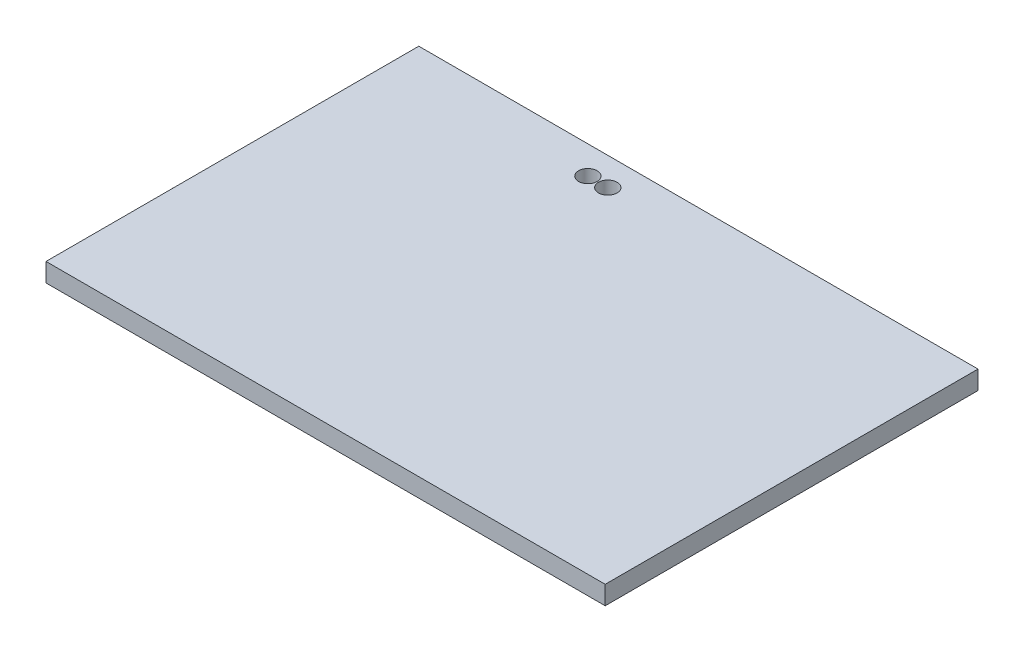
ISO-10303-21;
HEADER;
FILE_DESCRIPTION(('STEP AP214'),'2;1');
FILE_NAME('part.step','',(''),(''),'','','');
FILE_SCHEMA(('AUTOMOTIVE_DESIGN { 1 0 10303 214 1 1 1 1 }'));
ENDSEC;
DATA;
#1=APPLICATION_CONTEXT('core data for automotive mechanical design processes');
#2=APPLICATION_PROTOCOL_DEFINITION('international standard','automotive_design',2000,#1);
#3=PRODUCT_CONTEXT('',#1,'mechanical');
#4=PRODUCT('Part','Part','',(#3));
#5=PRODUCT_RELATED_PRODUCT_CATEGORY('part','',(#4));
#6=PRODUCT_DEFINITION_FORMATION('','',#4);
#7=PRODUCT_DEFINITION_CONTEXT('part definition',#1,'design');
#8=PRODUCT_DEFINITION('design','',#6,#7);
#9=PRODUCT_DEFINITION_SHAPE('','',#8);
#10=(LENGTH_UNIT() NAMED_UNIT(*) SI_UNIT(.MILLI.,.METRE.));
#11=(NAMED_UNIT(*) PLANE_ANGLE_UNIT() SI_UNIT($,.RADIAN.));
#12=(NAMED_UNIT(*) SI_UNIT($,.STERADIAN.) SOLID_ANGLE_UNIT());
#13=UNCERTAINTY_MEASURE_WITH_UNIT(LENGTH_MEASURE(1.E-05),#10,'distance_accuracy_value','');
#14=(GEOMETRIC_REPRESENTATION_CONTEXT(3) GLOBAL_UNCERTAINTY_ASSIGNED_CONTEXT((#13)) GLOBAL_UNIT_ASSIGNED_CONTEXT((#10,
#11,#12)) REPRESENTATION_CONTEXT('',''));
#15=CARTESIAN_POINT('',(0.,0.,0.));
#16=DIRECTION('',(0.,0.,1.));
#17=DIRECTION('',(1.,0.,0.));
#18=AXIS2_PLACEMENT_3D('',#15,#16,#17);
#19=CARTESIAN_POINT('',(150.,10.,100.));
#20=DIRECTION('',(-1.,0.,0.));
#21=DIRECTION('',(0.,0.,1.));
#22=AXIS2_PLACEMENT_3D('',#19,#20,#21);
#23=PLANE('',#22);
#24=DIRECTION('',(0.,0.,-1.));
#25=VECTOR('',#24,1.);
#26=CARTESIAN_POINT('',(150.,0.,100.));
#27=LINE('',#26,#25);
#28=CARTESIAN_POINT('',(150.,0.,100.));
#29=VERTEX_POINT('',#28);
#30=CARTESIAN_POINT('',(150.,0.,-100.));
#31=VERTEX_POINT('',#30);
#32=EDGE_CURVE('E96',#29,#31,#27,.T.);
#33=ORIENTED_EDGE('',*,*,#32,.T.);
#34=DIRECTION('',(0.,-1.,0.));
#35=VECTOR('',#34,1.);
#36=CARTESIAN_POINT('',(150.,10.,-100.));
#37=LINE('',#36,#35);
#38=CARTESIAN_POINT('',(150.,10.,-100.));
#39=VERTEX_POINT('',#38);
#40=EDGE_CURVE('E11',#39,#31,#37,.T.);
#41=ORIENTED_EDGE('',*,*,#40,.F.);
#42=DIRECTION('',(0.,0.,-1.));
#43=VECTOR('',#42,1.);
#44=CARTESIAN_POINT('',(150.,10.,100.));
#45=LINE('',#44,#43);
#46=CARTESIAN_POINT('',(150.,10.,100.));
#47=VERTEX_POINT('',#46);
#48=EDGE_CURVE('E84',#47,#39,#45,.T.);
#49=ORIENTED_EDGE('',*,*,#48,.F.);
#50=DIRECTION('',(0.,-1.,0.));
#51=VECTOR('',#50,1.);
#52=CARTESIAN_POINT('',(150.,10.,100.));
#53=LINE('',#52,#51);
#54=EDGE_CURVE('E92',#47,#29,#53,.T.);
#55=ORIENTED_EDGE('',*,*,#54,.T.);
#56=EDGE_LOOP('',(#33,#41,#49,#55));
#57=FACE_BOUND('',#56,.T.);
#58=ADVANCED_FACE('F33',(#57),#23,.F.);
#59=CARTESIAN_POINT('',(-150.,10.,-100.));
#60=DIRECTION('',(0.,0.,1.));
#61=DIRECTION('',(1.,0.,0.));
#62=AXIS2_PLACEMENT_3D('',#59,#60,#61);
#63=PLANE('',#62);
#64=DIRECTION('',(-1.,0.,0.));
#65=VECTOR('',#64,1.);
#66=CARTESIAN_POINT('',(-150.,0.,-100.));
#67=LINE('',#66,#65);
#68=CARTESIAN_POINT('',(-150.,0.,-100.));
#69=VERTEX_POINT('',#68);
#70=EDGE_CURVE('E88',#31,#69,#67,.T.);
#71=ORIENTED_EDGE('',*,*,#70,.T.);
#72=DIRECTION('',(0.,-1.,0.));
#73=VECTOR('',#72,1.);
#74=CARTESIAN_POINT('',(-150.,10.,-100.));
#75=LINE('',#74,#73);
#76=CARTESIAN_POINT('',(-150.,10.,-100.));
#77=VERTEX_POINT('',#76);
#78=EDGE_CURVE('E41',#77,#69,#75,.T.);
#79=ORIENTED_EDGE('',*,*,#78,.F.);
#80=DIRECTION('',(-1.,0.,0.));
#81=VECTOR('',#80,1.);
#82=CARTESIAN_POINT('',(-150.,10.,-100.));
#83=LINE('',#82,#81);
#84=EDGE_CURVE('E79',#39,#77,#83,.T.);
#85=ORIENTED_EDGE('',*,*,#84,.F.);
#86=ORIENTED_EDGE('',*,*,#40,.T.);
#87=EDGE_LOOP('',(#71,#79,#85,#86));
#88=FACE_BOUND('',#87,.T.);
#89=ADVANCED_FACE('F87',(#88),#63,.F.);
#90=CARTESIAN_POINT('',(-150.,10.,100.));
#91=DIRECTION('',(1.,0.,0.));
#92=DIRECTION('',(0.,0.,-1.));
#93=AXIS2_PLACEMENT_3D('',#90,#91,#92);
#94=PLANE('',#93);
#95=DIRECTION('',(0.,0.,1.));
#96=VECTOR('',#95,1.);
#97=CARTESIAN_POINT('',(-150.,0.,100.));
#98=LINE('',#97,#96);
#99=CARTESIAN_POINT('',(-150.,0.,100.));
#100=VERTEX_POINT('',#99);
#101=EDGE_CURVE('E66',#69,#100,#98,.T.);
#102=ORIENTED_EDGE('',*,*,#101,.T.);
#103=DIRECTION('',(0.,-1.,0.));
#104=VECTOR('',#103,1.);
#105=CARTESIAN_POINT('',(-150.,10.,100.));
#106=LINE('',#105,#104);
#107=CARTESIAN_POINT('',(-150.,10.,100.));
#108=VERTEX_POINT('',#107);
#109=EDGE_CURVE('E89',#108,#100,#106,.T.);
#110=ORIENTED_EDGE('',*,*,#109,.F.);
#111=DIRECTION('',(0.,0.,1.));
#112=VECTOR('',#111,1.);
#113=CARTESIAN_POINT('',(-150.,10.,100.));
#114=LINE('',#113,#112);
#115=EDGE_CURVE('E82',#77,#108,#114,.T.);
#116=ORIENTED_EDGE('',*,*,#115,.F.);
#117=ORIENTED_EDGE('',*,*,#78,.T.);
#118=EDGE_LOOP('',(#102,#110,#116,#117));
#119=FACE_BOUND('',#118,.T.);
#120=ADVANCED_FACE('F90',(#119),#94,.F.);
#121=CARTESIAN_POINT('',(-150.,10.,100.));
#122=DIRECTION('',(0.,0.,-1.));
#123=DIRECTION('',(-1.,0.,0.));
#124=AXIS2_PLACEMENT_3D('',#121,#122,#123);
#125=PLANE('',#124);
#126=DIRECTION('',(1.,0.,0.));
#127=VECTOR('',#126,1.);
#128=CARTESIAN_POINT('',(-150.,0.,100.));
#129=LINE('',#128,#127);
#130=EDGE_CURVE('E72',#100,#29,#129,.T.);
#131=ORIENTED_EDGE('',*,*,#130,.T.);
#132=ORIENTED_EDGE('',*,*,#54,.F.);
#133=DIRECTION('',(1.,0.,0.));
#134=VECTOR('',#133,1.);
#135=CARTESIAN_POINT('',(-150.,10.,100.));
#136=LINE('',#135,#134);
#137=EDGE_CURVE('E49',#108,#47,#136,.T.);
#138=ORIENTED_EDGE('',*,*,#137,.F.);
#139=ORIENTED_EDGE('',*,*,#109,.T.);
#140=EDGE_LOOP('',(#131,#132,#138,#139));
#141=FACE_BOUND('',#140,.T.);
#142=ADVANCED_FACE('F104',(#141),#125,.F.);
#143=CARTESIAN_POINT('',(0.,10.,0.));
#144=DIRECTION('',(0.,-1.,0.));
#145=DIRECTION('',(0.,0.,-1.));
#146=AXIS2_PLACEMENT_3D('',#143,#144,#145);
#147=PLANE('',#146);
#148=CARTESIAN_POINT('',(-33.6107433476923,10.,-85.));
#149=DIRECTION('',(0.,1.,0.));
#150=DIRECTION('',(0.,0.,1.));
#151=AXIS2_PLACEMENT_3D('',#148,#149,#150);
#152=CIRCLE('',#151,5.);
#153=CARTESIAN_POINT('',(-33.6107433476923,10.,-80.));
#154=VERTEX_POINT('',#153);
#155=EDGE_CURVE('E118',#154,#154,#152,.T.);
#156=ORIENTED_EDGE('',*,*,#155,.F.);
#157=EDGE_LOOP('',(#156));
#158=FACE_BOUND('',#157,.T.);
#159=CARTESIAN_POINT('',(-44.2810342732135,10.,-85.));
#160=DIRECTION('',(0.,1.,0.));
#161=DIRECTION('',(0.,0.,1.));
#162=AXIS2_PLACEMENT_3D('',#159,#160,#161);
#163=CIRCLE('',#162,5.);
#164=CARTESIAN_POINT('',(-44.2810342732135,10.,-80.));
#165=VERTEX_POINT('',#164);
#166=EDGE_CURVE('E112',#165,#165,#163,.T.);
#167=ORIENTED_EDGE('',*,*,#166,.F.);
#168=EDGE_LOOP('',(#167));
#169=FACE_BOUND('',#168,.T.);
#170=ORIENTED_EDGE('',*,*,#48,.T.);
#171=ORIENTED_EDGE('',*,*,#84,.T.);
#172=ORIENTED_EDGE('',*,*,#115,.T.);
#173=ORIENTED_EDGE('',*,*,#137,.T.);
#174=EDGE_LOOP('',(#170,#171,#172,#173));
#175=FACE_BOUND('',#174,.T.);
#176=ADVANCED_FACE('F80',(#158,#169,#175),#147,.F.);
#177=CARTESIAN_POINT('',(0.,0.,0.));
#178=DIRECTION('',(0.,-1.,0.));
#179=DIRECTION('',(0.,0.,-1.));
#180=AXIS2_PLACEMENT_3D('',#177,#178,#179);
#181=PLANE('',#180);
#182=CARTESIAN_POINT('',(-33.6107433476923,0.,-85.));
#183=DIRECTION('',(0.,-1.,0.));
#184=DIRECTION('',(0.,0.,-1.));
#185=AXIS2_PLACEMENT_3D('',#182,#183,#184);
#186=CIRCLE('',#185,5.);
#187=CARTESIAN_POINT('',(-33.6107433476923,0.,-90.));
#188=VERTEX_POINT('',#187);
#189=EDGE_CURVE('E115',#188,#188,#186,.F.);
#190=ORIENTED_EDGE('',*,*,#189,.T.);
#191=EDGE_LOOP('',(#190));
#192=FACE_BOUND('',#191,.T.);
#193=CARTESIAN_POINT('',(-44.2810342732135,0.,-85.));
#194=DIRECTION('',(0.,-1.,0.));
#195=DIRECTION('',(0.,0.,-1.));
#196=AXIS2_PLACEMENT_3D('',#193,#194,#195);
#197=CIRCLE('',#196,5.);
#198=CARTESIAN_POINT('',(-44.2810342732135,0.,-90.));
#199=VERTEX_POINT('',#198);
#200=EDGE_CURVE('E99',#199,#199,#197,.F.);
#201=ORIENTED_EDGE('',*,*,#200,.T.);
#202=EDGE_LOOP('',(#201));
#203=FACE_BOUND('',#202,.T.);
#204=ORIENTED_EDGE('',*,*,#32,.F.);
#205=ORIENTED_EDGE('',*,*,#130,.F.);
#206=ORIENTED_EDGE('',*,*,#101,.F.);
#207=ORIENTED_EDGE('',*,*,#70,.F.);
#208=EDGE_LOOP('',(#204,#205,#206,#207));
#209=FACE_BOUND('',#208,.T.);
#210=ADVANCED_FACE('F107',(#192,#203,#209),#181,.T.);
#211=CARTESIAN_POINT('',(-44.2810342732135,-14.142135623731,-85.));
#212=DIRECTION('',(0.,1.,0.));
#213=DIRECTION('',(0.,0.,1.));
#214=AXIS2_PLACEMENT_3D('',#211,#212,#213);
#215=CYLINDRICAL_SURFACE('',#214,5.);
#216=ORIENTED_EDGE('',*,*,#166,.T.);
#217=EDGE_LOOP('',(#216));
#218=FACE_BOUND('',#217,.T.);
#219=ORIENTED_EDGE('',*,*,#200,.F.);
#220=EDGE_LOOP('',(#219));
#221=FACE_BOUND('',#220,.T.);
#222=ADVANCED_FACE('F130',(#218,#221),#215,.F.);
#223=CARTESIAN_POINT('',(-33.6107433476923,-14.142135623731,-85.));
#224=DIRECTION('',(0.,1.,0.));
#225=DIRECTION('',(0.,0.,1.));
#226=AXIS2_PLACEMENT_3D('',#223,#224,#225);
#227=CYLINDRICAL_SURFACE('',#226,5.);
#228=ORIENTED_EDGE('',*,*,#155,.T.);
#229=EDGE_LOOP('',(#228));
#230=FACE_BOUND('',#229,.T.);
#231=ORIENTED_EDGE('',*,*,#189,.F.);
#232=EDGE_LOOP('',(#231));
#233=FACE_BOUND('',#232,.T.);
#234=ADVANCED_FACE('F122',(#230,#233),#227,.F.);
#235=CLOSED_SHELL('',(#58,#89,#120,#142,#176,#210,#222,#234));
#236=MANIFOLD_SOLID_BREP('B2',#235);
#237=ADVANCED_BREP_SHAPE_REPRESENTATION('',(#18,#236),#14);
#238=SHAPE_DEFINITION_REPRESENTATION(#9,#237);
ENDSEC;
END-ISO-10303-21;
